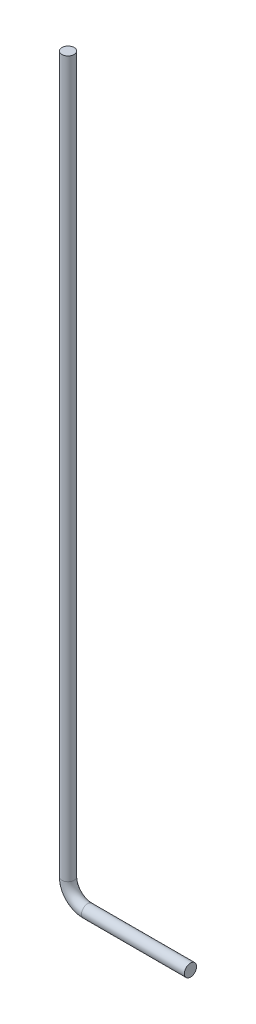
ISO-10303-21;
HEADER;
FILE_DESCRIPTION(('STEP AP214'),'2;1');
FILE_NAME('part.step','',(''),(''),'','','');
FILE_SCHEMA(('AUTOMOTIVE_DESIGN { 1 0 10303 214 1 1 1 1 }'));
ENDSEC;
DATA;
#1=APPLICATION_CONTEXT('core data for automotive mechanical design processes');
#2=APPLICATION_PROTOCOL_DEFINITION('international standard','automotive_design',2000,#1);
#3=PRODUCT_CONTEXT('',#1,'mechanical');
#4=PRODUCT('Part','Part','',(#3));
#5=PRODUCT_RELATED_PRODUCT_CATEGORY('part','',(#4));
#6=PRODUCT_DEFINITION_FORMATION('','',#4);
#7=PRODUCT_DEFINITION_CONTEXT('part definition',#1,'design');
#8=PRODUCT_DEFINITION('design','',#6,#7);
#9=PRODUCT_DEFINITION_SHAPE('','',#8);
#10=(LENGTH_UNIT() NAMED_UNIT(*) SI_UNIT(.MILLI.,.METRE.));
#11=(NAMED_UNIT(*) PLANE_ANGLE_UNIT() SI_UNIT($,.RADIAN.));
#12=(NAMED_UNIT(*) SI_UNIT($,.STERADIAN.) SOLID_ANGLE_UNIT());
#13=UNCERTAINTY_MEASURE_WITH_UNIT(LENGTH_MEASURE(1.E-05),#10,'distance_accuracy_value','');
#14=(GEOMETRIC_REPRESENTATION_CONTEXT(3) GLOBAL_UNCERTAINTY_ASSIGNED_CONTEXT((#13)) GLOBAL_UNIT_ASSIGNED_CONTEXT((#10,
#11,#12)) REPRESENTATION_CONTEXT('',''));
#15=CARTESIAN_POINT('',(0.,0.,0.));
#16=DIRECTION('',(0.,0.,1.));
#17=DIRECTION('',(1.,0.,0.));
#18=AXIS2_PLACEMENT_3D('',#15,#16,#17);
#19=CARTESIAN_POINT('',(0.,300.,0.));
#20=DIRECTION('',(0.,1.,0.));
#21=DIRECTION('',(0.,0.,1.));
#22=AXIS2_PLACEMENT_3D('',#19,#20,#21);
#23=PLANE('',#22);
#24=CARTESIAN_POINT('',(0.,300.,0.));
#25=DIRECTION('',(0.,1.,0.));
#26=DIRECTION('',(0.,0.,1.));
#27=AXIS2_PLACEMENT_3D('',#24,#25,#26);
#28=CIRCLE('',#27,2.5);
#29=CARTESIAN_POINT('',(0.,300.,2.5));
#30=VERTEX_POINT('',#29);
#31=EDGE_CURVE('E68',#30,#30,#28,.T.);
#32=ORIENTED_EDGE('',*,*,#31,.T.);
#33=EDGE_LOOP('',(#32));
#34=FACE_BOUND('',#33,.T.);
#35=ADVANCED_FACE('F51',(#34),#23,.T.);
#36=CARTESIAN_POINT('',(50.,0.,0.));
#37=DIRECTION('',(-1.,0.,0.));
#38=DIRECTION('',(0.,0.,1.));
#39=AXIS2_PLACEMENT_3D('',#36,#37,#38);
#40=PLANE('',#39);
#41=CARTESIAN_POINT('',(50.,0.,0.));
#42=DIRECTION('',(-1.,0.,0.));
#43=DIRECTION('',(0.,0.,1.));
#44=AXIS2_PLACEMENT_3D('',#41,#42,#43);
#45=CIRCLE('',#44,2.5);
#46=CARTESIAN_POINT('',(50.,0.,2.5));
#47=VERTEX_POINT('',#46);
#48=EDGE_CURVE('E11',#47,#47,#45,.T.);
#49=ORIENTED_EDGE('',*,*,#48,.F.);
#50=EDGE_LOOP('',(#49));
#51=FACE_BOUND('',#50,.T.);
#52=ADVANCED_FACE('F79',(#51),#40,.F.);
#53=CARTESIAN_POINT('',(0.,300.,0.));
#54=DIRECTION('',(0.,-1.,0.));
#55=DIRECTION('',(0.,0.,-1.));
#56=AXIS2_PLACEMENT_3D('',#53,#54,#55);
#57=CYLINDRICAL_SURFACE('',#56,2.5);
#58=CARTESIAN_POINT('',(0.,8.,0.));
#59=DIRECTION('',(0.,1.,0.));
#60=DIRECTION('',(0.,0.,1.));
#61=AXIS2_PLACEMENT_3D('',#58,#59,#60);
#62=CIRCLE('',#61,2.5);
#63=CARTESIAN_POINT('',(-2.5,8.,0.));
#64=VERTEX_POINT('',#63);
#65=EDGE_CURVE('E63',#64,#64,#62,.T.);
#66=ORIENTED_EDGE('',*,*,#65,.T.);
#67=EDGE_LOOP('',(#66));
#68=FACE_BOUND('',#67,.T.);
#69=ORIENTED_EDGE('',*,*,#31,.F.);
#70=EDGE_LOOP('',(#69));
#71=FACE_BOUND('',#70,.T.);
#72=ADVANCED_FACE('F76',(#68,#71),#57,.T.);
#73=CARTESIAN_POINT('',(8.,8.,0.));
#74=DIRECTION('',(0.,0.,1.));
#75=DIRECTION('',(1.,0.,0.));
#76=AXIS2_PLACEMENT_3D('',#73,#74,#75);
#77=TOROIDAL_SURFACE('',#76,8.,2.5);
#78=CARTESIAN_POINT('',(8.,0.,0.));
#79=DIRECTION('',(-1.,0.,0.));
#80=DIRECTION('',(0.,0.,1.));
#81=AXIS2_PLACEMENT_3D('',#78,#79,#80);
#82=CIRCLE('',#81,2.5);
#83=CARTESIAN_POINT('',(8.,-2.5,0.));
#84=VERTEX_POINT('',#83);
#85=EDGE_CURVE('E58',#84,#84,#82,.T.);
#86=CARTESIAN_POINT('',(8.,8.,0.));
#87=DIRECTION('',(0.,0.,1.));
#88=DIRECTION('',(1.,0.,0.));
#89=AXIS2_PLACEMENT_3D('',#86,#87,#88);
#90=CIRCLE('',#89,10.5);
#91=EDGE_CURVE('',#64,#84,#90,.T.);
#92=ORIENTED_EDGE('',*,*,#65,.F.);
#93=ORIENTED_EDGE('',*,*,#85,.T.);
#94=ORIENTED_EDGE('',*,*,#91,.T.);
#95=ORIENTED_EDGE('',*,*,#91,.F.);
#96=EDGE_LOOP('',(#92,#94,#93,#95));
#97=FACE_BOUND('',#96,.T.);
#98=ADVANCED_FACE('F78',(#97),#77,.T.);
#99=CARTESIAN_POINT('',(8.,0.,0.));
#100=DIRECTION('',(1.,0.,0.));
#101=DIRECTION('',(0.,0.,-1.));
#102=AXIS2_PLACEMENT_3D('',#99,#100,#101);
#103=CYLINDRICAL_SURFACE('',#102,2.5);
#104=ORIENTED_EDGE('',*,*,#48,.T.);
#105=EDGE_LOOP('',(#104));
#106=FACE_BOUND('',#105,.T.);
#107=ORIENTED_EDGE('',*,*,#85,.F.);
#108=EDGE_LOOP('',(#107));
#109=FACE_BOUND('',#108,.T.);
#110=ADVANCED_FACE('F86',(#106,#109),#103,.T.);
#111=CLOSED_SHELL('',(#35,#52,#72,#98,#110));
#112=MANIFOLD_SOLID_BREP('B2',#111);
#113=ADVANCED_BREP_SHAPE_REPRESENTATION('',(#18,#112),#14);
#114=SHAPE_DEFINITION_REPRESENTATION(#9,#113);
ENDSEC;
END-ISO-10303-21;
